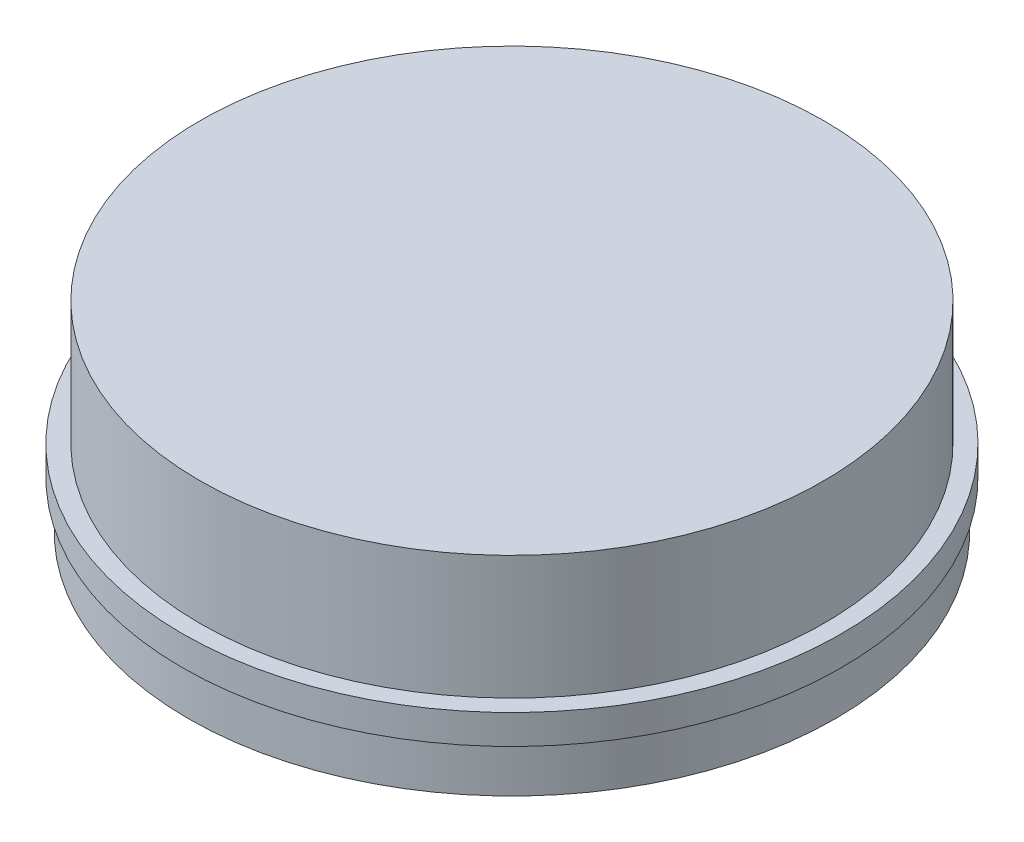
ISO-10303-21;
HEADER;
FILE_DESCRIPTION(('STEP AP214'),'2;1');
FILE_NAME('part.step','',(''),(''),'','','');
FILE_SCHEMA(('AUTOMOTIVE_DESIGN { 1 0 10303 214 1 1 1 1 }'));
ENDSEC;
DATA;
#1=APPLICATION_CONTEXT('core data for automotive mechanical design processes');
#2=APPLICATION_PROTOCOL_DEFINITION('international standard','automotive_design',2000,#1);
#3=PRODUCT_CONTEXT('',#1,'mechanical');
#4=PRODUCT('Part','Part','',(#3));
#5=PRODUCT_RELATED_PRODUCT_CATEGORY('part','',(#4));
#6=PRODUCT_DEFINITION_FORMATION('','',#4);
#7=PRODUCT_DEFINITION_CONTEXT('part definition',#1,'design');
#8=PRODUCT_DEFINITION('design','',#6,#7);
#9=PRODUCT_DEFINITION_SHAPE('','',#8);
#10=(LENGTH_UNIT() NAMED_UNIT(*) SI_UNIT(.MILLI.,.METRE.));
#11=(NAMED_UNIT(*) PLANE_ANGLE_UNIT() SI_UNIT($,.RADIAN.));
#12=(NAMED_UNIT(*) SI_UNIT($,.STERADIAN.) SOLID_ANGLE_UNIT());
#13=UNCERTAINTY_MEASURE_WITH_UNIT(LENGTH_MEASURE(1.E-05),#10,'distance_accuracy_value','');
#14=(GEOMETRIC_REPRESENTATION_CONTEXT(3) GLOBAL_UNCERTAINTY_ASSIGNED_CONTEXT((#13)) GLOBAL_UNIT_ASSIGNED_CONTEXT((#10,
#11,#12)) REPRESENTATION_CONTEXT('',''));
#15=CARTESIAN_POINT('',(0.,0.,0.));
#16=DIRECTION('',(0.,0.,1.));
#17=DIRECTION('',(1.,0.,0.));
#18=AXIS2_PLACEMENT_3D('',#15,#16,#17);
#19=CARTESIAN_POINT('',(0.,10.5,0.));
#20=DIRECTION('',(0.,-1.,0.));
#21=DIRECTION('',(0.,0.,-1.));
#22=AXIS2_PLACEMENT_3D('',#19,#20,#21);
#23=CYLINDRICAL_SURFACE('',#22,26.5);
#24=CARTESIAN_POINT('',(0.,10.5,0.));
#25=DIRECTION('',(0.,1.,0.));
#26=DIRECTION('',(0.,0.,1.));
#27=AXIS2_PLACEMENT_3D('',#24,#25,#26);
#28=CIRCLE('',#27,26.5);
#29=CARTESIAN_POINT('',(0.,10.5,-26.5));
#30=VERTEX_POINT('',#29);
#31=EDGE_CURVE('E46',#30,#30,#28,.T.);
#32=CARTESIAN_POINT('',(0.,0.,0.));
#33=DIRECTION('',(0.,1.,0.));
#34=DIRECTION('',(0.,0.,1.));
#35=AXIS2_PLACEMENT_3D('',#32,#33,#34);
#36=CIRCLE('',#35,26.5);
#37=CARTESIAN_POINT('',(0.,0.,-26.5));
#38=VERTEX_POINT('',#37);
#39=EDGE_CURVE('E42',#38,#38,#36,.T.);
#40=CARTESIAN_POINT('',(0.,10.5,-26.5));
#41=CARTESIAN_POINT('',(0.,10.390625,-26.5));
#42=CARTESIAN_POINT('',(0.,10.28125,-26.5));
#43=CARTESIAN_POINT('',(0.,10.0625,-26.5));
#44=CARTESIAN_POINT('',(0.,9.953125,-26.5));
#45=CARTESIAN_POINT('',(0.,9.734375,-26.5));
#46=CARTESIAN_POINT('',(0.,9.625,-26.5));
#47=CARTESIAN_POINT('',(0.,9.40625,-26.5));
#48=CARTESIAN_POINT('',(0.,9.296875,-26.5));
#49=CARTESIAN_POINT('',(0.,9.078125,-26.5));
#50=CARTESIAN_POINT('',(0.,8.96875,-26.5));
#51=CARTESIAN_POINT('',(0.,8.75,-26.5));
#52=CARTESIAN_POINT('',(0.,8.640625,-26.5));
#53=CARTESIAN_POINT('',(0.,8.421875,-26.5));
#54=CARTESIAN_POINT('',(0.,8.3125,-26.5));
#55=CARTESIAN_POINT('',(0.,8.09375,-26.5));
#56=CARTESIAN_POINT('',(0.,7.984375,-26.5));
#57=CARTESIAN_POINT('',(0.,7.765625,-26.5));
#58=CARTESIAN_POINT('',(0.,7.65625,-26.5));
#59=CARTESIAN_POINT('',(0.,7.4375,-26.5));
#60=CARTESIAN_POINT('',(0.,7.328125,-26.5));
#61=CARTESIAN_POINT('',(0.,7.109375,-26.5));
#62=CARTESIAN_POINT('',(0.,7.,-26.5));
#63=CARTESIAN_POINT('',(0.,6.78125,-26.5));
#64=CARTESIAN_POINT('',(0.,6.671875,-26.5));
#65=CARTESIAN_POINT('',(0.,6.453125,-26.5));
#66=CARTESIAN_POINT('',(0.,6.34375,-26.5));
#67=CARTESIAN_POINT('',(0.,6.125,-26.5));
#68=CARTESIAN_POINT('',(0.,6.015625,-26.5));
#69=CARTESIAN_POINT('',(0.,5.796875,-26.5));
#70=CARTESIAN_POINT('',(0.,5.6875,-26.5));
#71=CARTESIAN_POINT('',(0.,5.46875,-26.5));
#72=CARTESIAN_POINT('',(0.,5.359375,-26.5));
#73=CARTESIAN_POINT('',(0.,5.140625,-26.5));
#74=CARTESIAN_POINT('',(0.,5.03125,-26.5));
#75=CARTESIAN_POINT('',(0.,4.8125,-26.5));
#76=CARTESIAN_POINT('',(0.,4.703125,-26.5));
#77=CARTESIAN_POINT('',(0.,4.484375,-26.5));
#78=CARTESIAN_POINT('',(0.,4.375,-26.5));
#79=CARTESIAN_POINT('',(0.,4.15625,-26.5));
#80=CARTESIAN_POINT('',(0.,4.046875,-26.5));
#81=CARTESIAN_POINT('',(0.,3.828125,-26.5));
#82=CARTESIAN_POINT('',(0.,3.71875,-26.5));
#83=CARTESIAN_POINT('',(0.,3.5,-26.5));
#84=CARTESIAN_POINT('',(0.,3.390625,-26.5));
#85=CARTESIAN_POINT('',(0.,3.171875,-26.5));
#86=CARTESIAN_POINT('',(0.,3.0625,-26.5));
#87=CARTESIAN_POINT('',(0.,2.84375,-26.5));
#88=CARTESIAN_POINT('',(0.,2.734375,-26.5));
#89=CARTESIAN_POINT('',(0.,2.515625,-26.5));
#90=CARTESIAN_POINT('',(0.,2.40625,-26.5));
#91=CARTESIAN_POINT('',(0.,2.1875,-26.5));
#92=CARTESIAN_POINT('',(0.,2.078125,-26.5));
#93=CARTESIAN_POINT('',(0.,1.859375,-26.5));
#94=CARTESIAN_POINT('',(0.,1.75,-26.5));
#95=CARTESIAN_POINT('',(0.,1.53125,-26.5));
#96=CARTESIAN_POINT('',(0.,1.421875,-26.5));
#97=CARTESIAN_POINT('',(0.,1.203125,-26.5));
#98=CARTESIAN_POINT('',(0.,1.09375,-26.5));
#99=CARTESIAN_POINT('',(0.,0.875000000000001,-26.5));
#100=CARTESIAN_POINT('',(0.,0.765625000000001,-26.5));
#101=CARTESIAN_POINT('',(0.,0.546875,-26.5));
#102=CARTESIAN_POINT('',(0.,0.4375,-26.5));
#103=CARTESIAN_POINT('',(0.,0.21875,-26.5));
#104=CARTESIAN_POINT('',(0.,0.109375,-26.5));
#105=CARTESIAN_POINT('',(0.,0.,-26.5));
#106=B_SPLINE_CURVE_WITH_KNOTS('',3,(#40,#41,#42,#43,#44,#45,#46,#47,#48,#49,#50,#51,#52,#53,
#54,#55,#56,#57,#58,#59,#60,#61,#62,#63,#64,#65,#66,#67,#68,#69,#70,#71,#72,#73,#74,#75,#76,#77,
#78,#79,#80,#81,#82,#83,#84,#85,#86,#87,#88,#89,#90,#91,#92,#93,#94,#95,#96,#97,#98,#99,#100,
#101,#102,#103,#104,#105),.UNSPECIFIED.,.F.,.F.,(4,2,2,2,2,2,2,2,2,2,2,2,2,2,2,2,2,2,2,2,2,2,2,
2,2,2,2,2,2,2,2,2,4),(0.,0.328124999999999,0.656249999999999,0.984374999999999,1.3125,1.640625,
1.96875,2.296875,2.625,2.953125,3.28125,3.609375,3.9375,4.265625,4.59375,4.921875,5.25,5.578125,
5.90625,6.234375,6.5625,6.890625,7.21875,7.546875,7.875,8.203125,8.53125,8.859375,9.1875,
9.515625,9.84375,10.171875,10.5),.UNSPECIFIED.);
#107=EDGE_CURVE('BSEAM39',#30,#38,#106,.T.);
#108=ORIENTED_EDGE('',*,*,#31,.F.);
#109=ORIENTED_EDGE('',*,*,#39,.T.);
#110=ORIENTED_EDGE('',*,*,#107,.T.);
#111=ORIENTED_EDGE('',*,*,#107,.F.);
#112=EDGE_LOOP('',(#108,#110,#109,#111));
#113=FACE_BOUND('',#112,.T.);
#114=ADVANCED_FACE('F39',(#113),#23,.T.);
#115=CARTESIAN_POINT('',(0.,10.5,0.));
#116=DIRECTION('',(0.,1.,0.));
#117=DIRECTION('',(0.,0.,1.));
#118=AXIS2_PLACEMENT_3D('',#115,#116,#117);
#119=PLANE('',#118);
#120=ORIENTED_EDGE('',*,*,#31,.T.);
#121=EDGE_LOOP('',(#120));
#122=FACE_BOUND('',#121,.T.);
#123=ADVANCED_FACE('F91',(#122),#119,.T.);
#124=CARTESIAN_POINT('',(0.,-2.5,0.));
#125=DIRECTION('',(0.,1.,0.));
#126=DIRECTION('',(0.,0.,1.));
#127=AXIS2_PLACEMENT_3D('',#124,#125,#126);
#128=CYLINDRICAL_SURFACE('',#127,28.);
#129=CARTESIAN_POINT('',(0.,-2.5,0.));
#130=DIRECTION('',(0.,1.,0.));
#131=DIRECTION('',(0.,0.,1.));
#132=AXIS2_PLACEMENT_3D('',#129,#130,#131);
#133=CIRCLE('',#132,28.);
#134=CARTESIAN_POINT('',(0.,-2.5,28.));
#135=VERTEX_POINT('',#134);
#136=EDGE_CURVE('E55',#135,#135,#133,.T.);
#137=ORIENTED_EDGE('',*,*,#136,.T.);
#138=EDGE_LOOP('',(#137));
#139=FACE_BOUND('',#138,.T.);
#140=CARTESIAN_POINT('',(0.,0.,0.));
#141=DIRECTION('',(0.,1.,0.));
#142=DIRECTION('',(0.,0.,1.));
#143=AXIS2_PLACEMENT_3D('',#140,#141,#142);
#144=CIRCLE('',#143,28.);
#145=CARTESIAN_POINT('',(0.,0.,28.));
#146=VERTEX_POINT('',#145);
#147=EDGE_CURVE('E58',#146,#146,#144,.T.);
#148=ORIENTED_EDGE('',*,*,#147,.F.);
#149=EDGE_LOOP('',(#148));
#150=FACE_BOUND('',#149,.T.);
#151=ADVANCED_FACE('F96',(#139,#150),#128,.T.);
#152=CARTESIAN_POINT('',(0.,-2.5,0.));
#153=DIRECTION('',(0.,1.,0.));
#154=DIRECTION('',(0.,0.,1.));
#155=AXIS2_PLACEMENT_3D('',#152,#153,#154);
#156=PLANE('',#155);
#157=CARTESIAN_POINT('',(0.,-2.5,0.));
#158=DIRECTION('',(0.,1.,0.));
#159=DIRECTION('',(0.,0.,1.));
#160=AXIS2_PLACEMENT_3D('',#157,#158,#159);
#161=CIRCLE('',#160,27.5);
#162=CARTESIAN_POINT('',(0.,-2.5,27.5));
#163=VERTEX_POINT('',#162);
#164=EDGE_CURVE('E53',#163,#163,#161,.T.);
#165=ORIENTED_EDGE('',*,*,#164,.T.);
#166=EDGE_LOOP('',(#165));
#167=FACE_BOUND('',#166,.T.);
#168=ORIENTED_EDGE('',*,*,#136,.F.);
#169=EDGE_LOOP('',(#168));
#170=FACE_BOUND('',#169,.T.);
#171=ADVANCED_FACE('F87',(#167,#170),#156,.F.);
#172=CARTESIAN_POINT('',(0.,0.,0.));
#173=DIRECTION('',(0.,1.,0.));
#174=DIRECTION('',(0.,0.,1.));
#175=AXIS2_PLACEMENT_3D('',#172,#173,#174);
#176=PLANE('',#175);
#177=ORIENTED_EDGE('',*,*,#147,.T.);
#178=EDGE_LOOP('',(#177));
#179=FACE_BOUND('',#178,.T.);
#180=ORIENTED_EDGE('',*,*,#39,.F.);
#181=EDGE_LOOP('',(#180));
#182=FACE_BOUND('',#181,.T.);
#183=ADVANCED_FACE('F80',(#179,#182),#176,.T.);
#184=CARTESIAN_POINT('',(0.,-6.5,0.));
#185=DIRECTION('',(0.,1.,0.));
#186=DIRECTION('',(0.,0.,1.));
#187=AXIS2_PLACEMENT_3D('',#184,#185,#186);
#188=CYLINDRICAL_SURFACE('',#187,26.5);
#189=CARTESIAN_POINT('',(0.,-6.5,0.));
#190=DIRECTION('',(0.,1.,0.));
#191=DIRECTION('',(0.,0.,1.));
#192=AXIS2_PLACEMENT_3D('',#189,#190,#191);
#193=CIRCLE('',#192,26.5);
#194=CARTESIAN_POINT('',(0.,-6.5,26.5));
#195=VERTEX_POINT('',#194);
#196=EDGE_CURVE('E67',#195,#195,#193,.T.);
#197=ORIENTED_EDGE('',*,*,#196,.F.);
#198=EDGE_LOOP('',(#197));
#199=FACE_BOUND('',#198,.T.);
#200=CARTESIAN_POINT('',(0.,-2.5,0.));
#201=DIRECTION('',(0.,1.,0.));
#202=DIRECTION('',(0.,0.,1.));
#203=AXIS2_PLACEMENT_3D('',#200,#201,#202);
#204=CIRCLE('',#203,26.5);
#205=CARTESIAN_POINT('',(0.,-2.5,26.5));
#206=VERTEX_POINT('',#205);
#207=EDGE_CURVE('E10',#206,#206,#204,.T.);
#208=ORIENTED_EDGE('',*,*,#207,.T.);
#209=EDGE_LOOP('',(#208));
#210=FACE_BOUND('',#209,.T.);
#211=ADVANCED_FACE('F77',(#199,#210),#188,.F.);
#212=CARTESIAN_POINT('',(0.,-6.5,0.));
#213=DIRECTION('',(0.,1.,0.));
#214=DIRECTION('',(0.,0.,1.));
#215=AXIS2_PLACEMENT_3D('',#212,#213,#214);
#216=CYLINDRICAL_SURFACE('',#215,27.5);
#217=CARTESIAN_POINT('',(0.,-6.5,0.));
#218=DIRECTION('',(0.,1.,0.));
#219=DIRECTION('',(0.,0.,1.));
#220=AXIS2_PLACEMENT_3D('',#217,#218,#219);
#221=CIRCLE('',#220,27.5);
#222=CARTESIAN_POINT('',(0.,-6.5,27.5));
#223=VERTEX_POINT('',#222);
#224=EDGE_CURVE('E63',#223,#223,#221,.T.);
#225=ORIENTED_EDGE('',*,*,#224,.T.);
#226=EDGE_LOOP('',(#225));
#227=FACE_BOUND('',#226,.T.);
#228=ORIENTED_EDGE('',*,*,#164,.F.);
#229=EDGE_LOOP('',(#228));
#230=FACE_BOUND('',#229,.T.);
#231=ADVANCED_FACE('F79',(#227,#230),#216,.T.);
#232=CARTESIAN_POINT('',(0.,-6.5,0.));
#233=DIRECTION('',(0.,1.,0.));
#234=DIRECTION('',(0.,0.,1.));
#235=AXIS2_PLACEMENT_3D('',#232,#233,#234);
#236=PLANE('',#235);
#237=ORIENTED_EDGE('',*,*,#196,.T.);
#238=EDGE_LOOP('',(#237));
#239=FACE_BOUND('',#238,.T.);
#240=ORIENTED_EDGE('',*,*,#224,.F.);
#241=EDGE_LOOP('',(#240));
#242=FACE_BOUND('',#241,.T.);
#243=ADVANCED_FACE('F74',(#239,#242),#236,.F.);
#244=ORIENTED_EDGE('',*,*,#207,.F.);
#245=EDGE_LOOP('',(#244));
#246=FACE_BOUND('',#245,.T.);
#247=ADVANCED_FACE('F109',(#246),#156,.F.);
#248=CLOSED_SHELL('',(#114,#123,#151,#171,#183,#211,#231,#243,#247));
#249=MANIFOLD_SOLID_BREP('B2',#248);
#250=ADVANCED_BREP_SHAPE_REPRESENTATION('',(#18,#249),#14);
#251=SHAPE_DEFINITION_REPRESENTATION(#9,#250);
ENDSEC;
END-ISO-10303-21;
